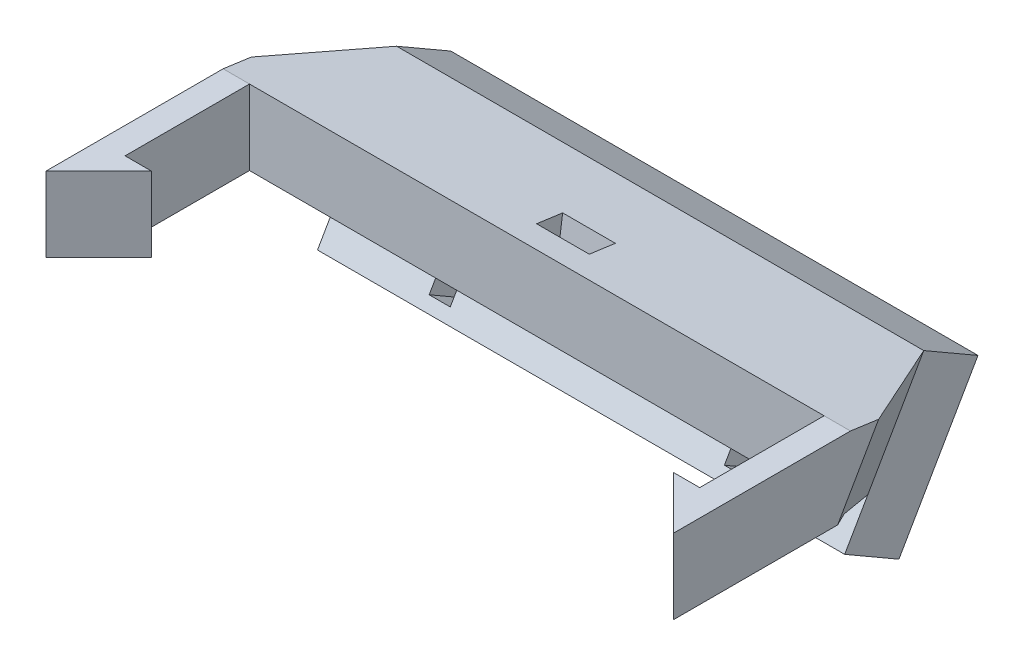
ISO-10303-21;
HEADER;
FILE_DESCRIPTION(('STEP AP214'),'2;1');
FILE_NAME('part.step','',(''),(''),'','','');
FILE_SCHEMA(('AUTOMOTIVE_DESIGN { 1 0 10303 214 1 1 1 1 }'));
ENDSEC;
DATA;
#1=APPLICATION_CONTEXT('core data for automotive mechanical design processes');
#2=APPLICATION_PROTOCOL_DEFINITION('international standard','automotive_design',2000,#1);
#3=PRODUCT_CONTEXT('',#1,'mechanical');
#4=PRODUCT('Part','Part','',(#3));
#5=PRODUCT_RELATED_PRODUCT_CATEGORY('part','',(#4));
#6=PRODUCT_DEFINITION_FORMATION('','',#4);
#7=PRODUCT_DEFINITION_CONTEXT('part definition',#1,'design');
#8=PRODUCT_DEFINITION('design','',#6,#7);
#9=PRODUCT_DEFINITION_SHAPE('','',#8);
#10=(LENGTH_UNIT() NAMED_UNIT(*) SI_UNIT(.MILLI.,.METRE.));
#11=(NAMED_UNIT(*) PLANE_ANGLE_UNIT() SI_UNIT($,.RADIAN.));
#12=(NAMED_UNIT(*) SI_UNIT($,.STERADIAN.) SOLID_ANGLE_UNIT());
#13=UNCERTAINTY_MEASURE_WITH_UNIT(LENGTH_MEASURE(1.E-05),#10,'distance_accuracy_value','');
#14=(GEOMETRIC_REPRESENTATION_CONTEXT(3) GLOBAL_UNCERTAINTY_ASSIGNED_CONTEXT((#13)) GLOBAL_UNIT_ASSIGNED_CONTEXT((#10,
#11,#12)) REPRESENTATION_CONTEXT('',''));
#15=CARTESIAN_POINT('',(0.,0.,0.));
#16=DIRECTION('',(0.,0.,1.));
#17=DIRECTION('',(1.,0.,0.));
#18=AXIS2_PLACEMENT_3D('',#15,#16,#17);
#19=CARTESIAN_POINT('',(37.7825,2.45728163563474,-14.859));
#20=DIRECTION('',(0.,-0.990554370221696,0.137120529588754));
#21=DIRECTION('',(0.,-0.137120529588754,-0.990554370221695));
#22=AXIS2_PLACEMENT_3D('',#19,#20,#21);
#23=PLANE('',#22);
#24=DIRECTION('',(0.,0.137120529588754,0.990554370221695));
#25=VECTOR('',#24,1.);
#26=CARTESIAN_POINT('',(37.7825,2.45728163563474,-14.859));
#27=LINE('',#26,#25);
#28=CARTESIAN_POINT('',(37.7825,4.04424143907504,-3.39485255702757));
#29=VERTEX_POINT('',#28);
#30=CARTESIAN_POINT('',(37.7825,4.51418432609816,0.));
#31=VERTEX_POINT('',#30);
#32=EDGE_CURVE('E332',#29,#31,#27,.T.);
#33=ORIENTED_EDGE('',*,*,#32,.F.);
#34=DIRECTION('',(-0.46221484131382,-0.121594094275768,-0.878391892441236));
#35=VECTOR('',#34,1.);
#36=CARTESIAN_POINT('',(33.0387987403693,2.79632378991416,-12.4097701974454));
#37=LINE('',#36,#35);
#38=CARTESIAN_POINT('',(31.75,2.45728163563474,-14.859));
#39=VERTEX_POINT('',#38);
#40=EDGE_CURVE('E384',#29,#39,#37,.T.);
#41=ORIENTED_EDGE('',*,*,#40,.T.);
#42=DIRECTION('',(1.,0.,0.));
#43=VECTOR('',#42,1.);
#44=CARTESIAN_POINT('',(37.7825,2.45728163563474,-14.859));
#45=LINE('',#44,#43);
#46=CARTESIAN_POINT('',(-31.75,2.45728163563474,-14.859));
#47=VERTEX_POINT('',#46);
#48=EDGE_CURVE('E324',#47,#39,#45,.T.);
#49=ORIENTED_EDGE('',*,*,#48,.F.);
#50=DIRECTION('',(-0.46221484131382,0.121594094275768,0.878391892441236));
#51=VECTOR('',#50,1.);
#52=CARTESIAN_POINT('',(-16.8948987294274,-1.45062530053327,-43.0895961452353));
#53=LINE('',#52,#51);
#54=CARTESIAN_POINT('',(-37.7825,4.04424143907504,-3.39485255702757));
#55=VERTEX_POINT('',#54);
#56=EDGE_CURVE('E369',#47,#55,#53,.T.);
#57=ORIENTED_EDGE('',*,*,#56,.T.);
#58=DIRECTION('',(0.,0.137120529588754,0.990554370221695));
#59=VECTOR('',#58,1.);
#60=CARTESIAN_POINT('',(-37.7825,2.45728163563474,-14.859));
#61=LINE('',#60,#59);
#62=CARTESIAN_POINT('',(-37.7825,4.51418432609816,0.));
#63=VERTEX_POINT('',#62);
#64=EDGE_CURVE('E333',#55,#63,#61,.T.);
#65=ORIENTED_EDGE('',*,*,#64,.T.);
#66=DIRECTION('',(-1.,0.,0.));
#67=VECTOR('',#66,1.);
#68=CARTESIAN_POINT('',(-37.7825,4.51418432609816,0.));
#69=LINE('',#68,#67);
#70=CARTESIAN_POINT('',(-34.6075,4.51418432609816,0.));
#71=VERTEX_POINT('',#70);
#72=EDGE_CURVE('E257',#71,#63,#69,.T.);
#73=ORIENTED_EDGE('',*,*,#72,.F.);
#74=DIRECTION('',(-1.,0.,0.));
#75=VECTOR('',#74,1.);
#76=CARTESIAN_POINT('',(37.7825,4.51418432609816,0.));
#77=LINE('',#76,#75);
#78=CARTESIAN_POINT('',(34.6075,4.51418432609816,0.));
#79=VERTEX_POINT('',#78);
#80=EDGE_CURVE('E327',#79,#71,#77,.T.);
#81=ORIENTED_EDGE('',*,*,#80,.F.);
#82=DIRECTION('',(-1.,0.,0.));
#83=VECTOR('',#82,1.);
#84=CARTESIAN_POINT('',(37.7825,4.51418432609816,0.));
#85=LINE('',#84,#83);
#86=EDGE_CURVE('E286',#31,#79,#85,.T.);
#87=ORIENTED_EDGE('',*,*,#86,.F.);
#88=EDGE_LOOP('',(#33,#41,#49,#57,#65,#73,#81,#87));
#89=FACE_BOUND('',#88,.T.);
#90=DIRECTION('',(0.,0.137120529588754,0.990554370221695));
#91=VECTOR('',#90,1.);
#92=CARTESIAN_POINT('',(-3.175,2.45728163563474,-14.859));
#93=LINE('',#92,#91);
#94=CARTESIAN_POINT('',(-3.175,3.64346896320957,-6.29002025090777));
#95=VERTEX_POINT('',#94);
#96=CARTESIAN_POINT('',(-3.175,4.07882664465387,-3.14501012545389));
#97=VERTEX_POINT('',#96);
#98=EDGE_CURVE('E339',#95,#97,#93,.T.);
#99=ORIENTED_EDGE('',*,*,#98,.F.);
#100=DIRECTION('',(-1.,0.,0.));
#101=VECTOR('',#100,1.);
#102=CARTESIAN_POINT('',(37.7825,3.64346896320957,-6.29002025090777));
#103=LINE('',#102,#101);
#104=CARTESIAN_POINT('',(3.175,3.64346896320957,-6.29002025090777));
#105=VERTEX_POINT('',#104);
#106=EDGE_CURVE('E347',#105,#95,#103,.T.);
#107=ORIENTED_EDGE('',*,*,#106,.F.);
#108=DIRECTION('',(0.,-0.137120529588754,-0.990554370221695));
#109=VECTOR('',#108,1.);
#110=CARTESIAN_POINT('',(3.175,2.45728163563474,-14.859));
#111=LINE('',#110,#109);
#112=CARTESIAN_POINT('',(3.175,4.07882664465387,-3.14501012545389));
#113=VERTEX_POINT('',#112);
#114=EDGE_CURVE('E344',#113,#105,#111,.T.);
#115=ORIENTED_EDGE('',*,*,#114,.F.);
#116=DIRECTION('',(1.,0.,0.));
#117=VECTOR('',#116,1.);
#118=CARTESIAN_POINT('',(37.7825,4.07882664465387,-3.14501012545389));
#119=LINE('',#118,#117);
#120=EDGE_CURVE('E342',#97,#113,#119,.T.);
#121=ORIENTED_EDGE('',*,*,#120,.F.);
#122=EDGE_LOOP('',(#99,#107,#115,#121));
#123=FACE_BOUND('',#122,.T.);
#124=ADVANCED_FACE('F33',(#89,#123),#23,.F.);
#125=CARTESIAN_POINT('',(37.7825,-9.20545357308142,-8.12551668776039));
#126=DIRECTION('',(0.,0.866025403784439,-0.5));
#127=DIRECTION('',(0.,0.5,0.866025403784439));
#128=AXIS2_PLACEMENT_3D('',#125,#126,#127);
#129=PLANE('',#128);
#130=DIRECTION('',(-1.,0.,0.));
#131=VECTOR('',#130,1.);
#132=CARTESIAN_POINT('',(37.7825,-9.20545357308142,-8.12551668776039));
#133=LINE('',#132,#131);
#134=CARTESIAN_POINT('',(31.75,-9.20545357308142,-8.12551668776039));
#135=VERTEX_POINT('',#134);
#136=CARTESIAN_POINT('',(-31.75,-9.20545357308143,-8.12551668776041));
#137=VERTEX_POINT('',#136);
#138=EDGE_CURVE('E241',#135,#137,#133,.T.);
#139=ORIENTED_EDGE('',*,*,#138,.F.);
#140=DIRECTION('',(0.490355767854127,0.435761179125731,0.754760502211889));
#141=VECTOR('',#140,1.);
#142=CARTESIAN_POINT('',(33.2005072597266,-7.9164409922874,-5.89288140622967));
#143=LINE('',#142,#141);
#144=CARTESIAN_POINT('',(37.0290175995719,-4.51418432609816,0.));
#145=VERTEX_POINT('',#144);
#146=EDGE_CURVE('E387',#135,#145,#143,.T.);
#147=ORIENTED_EDGE('',*,*,#146,.T.);
#148=DIRECTION('',(1.,0.,0.));
#149=VECTOR('',#148,1.);
#150=CARTESIAN_POINT('',(37.7825,-4.51418432609816,0.));
#151=LINE('',#150,#149);
#152=CARTESIAN_POINT('',(34.6075,-4.51418432609816,0.));
#153=VERTEX_POINT('',#152);
#154=EDGE_CURVE('E280',#153,#145,#151,.T.);
#155=ORIENTED_EDGE('',*,*,#154,.F.);
#156=DIRECTION('',(-1.,0.,0.));
#157=VECTOR('',#156,1.);
#158=CARTESIAN_POINT('',(37.7825,-4.51418432609816,0.));
#159=LINE('',#158,#157);
#160=CARTESIAN_POINT('',(-34.6075,-4.51418432609816,0.));
#161=VERTEX_POINT('',#160);
#162=EDGE_CURVE('E336',#153,#161,#159,.T.);
#163=ORIENTED_EDGE('',*,*,#162,.T.);
#164=DIRECTION('',(1.,0.,0.));
#165=VECTOR('',#164,1.);
#166=CARTESIAN_POINT('',(-37.7825,-4.51418432609816,0.));
#167=LINE('',#166,#165);
#168=CARTESIAN_POINT('',(-37.0290175995719,-4.51418432609816,0.));
#169=VERTEX_POINT('',#168);
#170=EDGE_CURVE('E263',#169,#161,#167,.T.);
#171=ORIENTED_EDGE('',*,*,#170,.F.);
#172=DIRECTION('',(0.490355767854127,-0.435761179125731,-0.754760502211889));
#173=VECTOR('',#172,1.);
#174=CARTESIAN_POINT('',(-15.0309952694675,-24.0630196359178,-33.859575985404));
#175=LINE('',#174,#173);
#176=EDGE_CURVE('E372',#169,#137,#175,.T.);
#177=ORIENTED_EDGE('',*,*,#176,.T.);
#178=EDGE_LOOP('',(#139,#147,#155,#163,#171,#177));
#179=FACE_BOUND('',#178,.T.);
#180=DIRECTION('',(0.,-0.5,-0.866025403784439));
#181=VECTOR('',#180,1.);
#182=CARTESIAN_POINT('',(-3.175,-10.6104980717669,-10.5591251463789));
#183=LINE('',#182,#181);
#184=CARTESIAN_POINT('',(-3.175,-5.55963649656401,-1.81077627613001));
#185=VERTEX_POINT('',#184);
#186=CARTESIAN_POINT('',(-3.175,-7.27324892364753,-4.77884006432008));
#187=VERTEX_POINT('',#186);
#188=EDGE_CURVE('E361',#185,#187,#183,.T.);
#189=ORIENTED_EDGE('',*,*,#188,.F.);
#190=DIRECTION('',(-1.,0.,0.));
#191=VECTOR('',#190,1.);
#192=CARTESIAN_POINT('',(-3.175,-5.55963649656401,-1.81077627613001));
#193=LINE('',#192,#191);
#194=CARTESIAN_POINT('',(3.175,-5.55963649656401,-1.81077627613001));
#195=VERTEX_POINT('',#194);
#196=EDGE_CURVE('E358',#195,#185,#193,.T.);
#197=ORIENTED_EDGE('',*,*,#196,.F.);
#198=DIRECTION('',(0.,0.5,0.866025403784439));
#199=VECTOR('',#198,1.);
#200=CARTESIAN_POINT('',(3.175,-10.6104980717669,-10.5591251463789));
#201=LINE('',#200,#199);
#202=CARTESIAN_POINT('',(3.175,-7.27324892364753,-4.77884006432008));
#203=VERTEX_POINT('',#202);
#204=EDGE_CURVE('E366',#203,#195,#201,.T.);
#205=ORIENTED_EDGE('',*,*,#204,.F.);
#206=DIRECTION('',(1.,0.,0.));
#207=VECTOR('',#206,1.);
#208=CARTESIAN_POINT('',(-3.175,-7.27324892364753,-4.77884006432008));
#209=LINE('',#208,#207);
#210=EDGE_CURVE('E363',#187,#203,#209,.T.);
#211=ORIENTED_EDGE('',*,*,#210,.F.);
#212=EDGE_LOOP('',(#189,#197,#205,#211));
#213=FACE_BOUND('',#212,.T.);
#214=ADVANCED_FACE('F495',(#179,#213),#129,.F.);
#215=CARTESIAN_POINT('',(0.,0.,0.));
#216=DIRECTION('',(0.,0.,1.));
#217=DIRECTION('',(1.,0.,0.));
#218=AXIS2_PLACEMENT_3D('',#215,#216,#217);
#219=PLANE('',#218);
#220=ORIENTED_EDGE('',*,*,#162,.F.);
#221=DIRECTION('',(0.,-1.,0.));
#222=VECTOR('',#221,1.);
#223=CARTESIAN_POINT('',(34.6075,4.51418432609816,0.));
#224=LINE('',#223,#222);
#225=EDGE_CURVE('E283',#79,#153,#224,.T.);
#226=ORIENTED_EDGE('',*,*,#225,.F.);
#227=ORIENTED_EDGE('',*,*,#80,.T.);
#228=DIRECTION('',(0.,1.,0.));
#229=VECTOR('',#228,1.);
#230=CARTESIAN_POINT('',(-34.6075,4.51418432609816,0.));
#231=LINE('',#230,#229);
#232=EDGE_CURVE('E260',#161,#71,#231,.T.);
#233=ORIENTED_EDGE('',*,*,#232,.F.);
#234=EDGE_LOOP('',(#220,#226,#227,#233));
#235=FACE_BOUND('',#234,.T.);
#236=ADVANCED_FACE('F501',(#235),#219,.T.);
#237=CARTESIAN_POINT('',(-37.7825,17.78,-3.175));
#238=DIRECTION('',(-1.,0.,0.));
#239=DIRECTION('',(0.,0.,1.));
#240=AXIS2_PLACEMENT_3D('',#237,#238,#239);
#241=PLANE('',#240);
#242=DIRECTION('',(0.,0.866025403784438,-0.500000000000001));
#243=VECTOR('',#242,1.);
#244=CARTESIAN_POINT('',(-37.7825,-25.8621498261207,13.8716104904235));
#245=LINE('',#244,#243);
#246=CARTESIAN_POINT('',(-37.7825,-4.51418432609816,1.54635686233462));
#247=VERTEX_POINT('',#246);
#248=EDGE_CURVE('E377',#247,#55,#245,.T.);
#249=ORIENTED_EDGE('',*,*,#248,.F.);
#250=DIRECTION('',(0.,0.,-1.));
#251=VECTOR('',#250,1.);
#252=CARTESIAN_POINT('',(-37.7825,-4.51418432609816,14.986));
#253=LINE('',#252,#251);
#254=CARTESIAN_POINT('',(-37.7825,-4.51418432609816,21.336));
#255=VERTEX_POINT('',#254);
#256=EDGE_CURVE('E243',#255,#247,#253,.T.);
#257=ORIENTED_EDGE('',*,*,#256,.F.);
#258=DIRECTION('',(0.,-1.,0.));
#259=VECTOR('',#258,1.);
#260=CARTESIAN_POINT('',(-37.7825,13.4944404471673,21.336));
#261=LINE('',#260,#259);
#262=CARTESIAN_POINT('',(-37.7825,4.51418432609816,21.336));
#263=VERTEX_POINT('',#262);
#264=EDGE_CURVE('E298',#263,#255,#261,.T.);
#265=ORIENTED_EDGE('',*,*,#264,.F.);
#266=DIRECTION('',(0.,0.,-1.));
#267=VECTOR('',#266,1.);
#268=CARTESIAN_POINT('',(-37.7825,4.51418432609816,14.986));
#269=LINE('',#268,#267);
#270=EDGE_CURVE('E253',#263,#63,#269,.T.);
#271=ORIENTED_EDGE('',*,*,#270,.T.);
#272=ORIENTED_EDGE('',*,*,#64,.F.);
#273=EDGE_LOOP('',(#249,#257,#265,#271,#272));
#274=FACE_BOUND('',#273,.T.);
#275=ADVANCED_FACE('F35',(#274),#241,.T.);
#276=CARTESIAN_POINT('',(37.7825,17.78,-3.175));
#277=DIRECTION('',(1.,0.,0.));
#278=DIRECTION('',(0.,0.,-1.));
#279=AXIS2_PLACEMENT_3D('',#276,#277,#278);
#280=PLANE('',#279);
#281=DIRECTION('',(0.,0.866025403784438,-0.500000000000001));
#282=VECTOR('',#281,1.);
#283=CARTESIAN_POINT('',(37.7825,-25.8621498261207,13.8716104904235));
#284=LINE('',#283,#282);
#285=CARTESIAN_POINT('',(37.7825,-4.51418432609816,1.54635686233462));
#286=VERTEX_POINT('',#285);
#287=EDGE_CURVE('E394',#286,#29,#284,.T.);
#288=ORIENTED_EDGE('',*,*,#287,.T.);
#289=ORIENTED_EDGE('',*,*,#32,.T.);
#290=DIRECTION('',(0.,0.,-1.));
#291=VECTOR('',#290,1.);
#292=CARTESIAN_POINT('',(37.7825,4.51418432609816,14.986));
#293=LINE('',#292,#291);
#294=CARTESIAN_POINT('',(37.7825,4.51418432609816,21.336));
#295=VERTEX_POINT('',#294);
#296=EDGE_CURVE('E265',#295,#31,#293,.T.);
#297=ORIENTED_EDGE('',*,*,#296,.F.);
#298=DIRECTION('',(0.,-1.,0.));
#299=VECTOR('',#298,1.);
#300=CARTESIAN_POINT('',(37.7825,13.4944404471673,21.336));
#301=LINE('',#300,#299);
#302=CARTESIAN_POINT('',(37.7825,-4.51418432609816,21.336));
#303=VERTEX_POINT('',#302);
#304=EDGE_CURVE('E311',#295,#303,#301,.T.);
#305=ORIENTED_EDGE('',*,*,#304,.T.);
#306=DIRECTION('',(0.,0.,-1.));
#307=VECTOR('',#306,1.);
#308=CARTESIAN_POINT('',(37.7825,-4.51418432609816,14.986));
#309=LINE('',#308,#307);
#310=EDGE_CURVE('E276',#303,#286,#309,.T.);
#311=ORIENTED_EDGE('',*,*,#310,.T.);
#312=EDGE_LOOP('',(#288,#289,#297,#305,#311));
#313=FACE_BOUND('',#312,.T.);
#314=ADVANCED_FACE('F553',(#313),#280,.T.);
#315=CARTESIAN_POINT('',(-37.7825,-4.51418432609816,14.986));
#316=DIRECTION('',(0.,1.,0.));
#317=DIRECTION('',(0.,0.,1.));
#318=AXIS2_PLACEMENT_3D('',#315,#316,#317);
#319=PLANE('',#318);
#320=ORIENTED_EDGE('',*,*,#256,.T.);
#321=DIRECTION('',(0.43803005719749,0.,-0.898960326706114));
#322=VECTOR('',#321,1.);
#323=CARTESIAN_POINT('',(-43.0746503640248,-4.51418432609816,12.4073312225409));
#324=LINE('',#323,#322);
#325=EDGE_CURVE('E374',#247,#169,#324,.T.);
#326=ORIENTED_EDGE('',*,*,#325,.T.);
#327=ORIENTED_EDGE('',*,*,#170,.T.);
#328=DIRECTION('',(0.,0.,-1.));
#329=VECTOR('',#328,1.);
#330=CARTESIAN_POINT('',(-34.6075,-4.51418432609816,14.986));
#331=LINE('',#330,#329);
#332=CARTESIAN_POINT('',(-34.6075,-4.51418432609816,14.986));
#333=VERTEX_POINT('',#332);
#334=EDGE_CURVE('E245',#333,#161,#331,.T.);
#335=ORIENTED_EDGE('',*,*,#334,.F.);
#336=DIRECTION('',(1.,0.,0.));
#337=VECTOR('',#336,1.);
#338=CARTESIAN_POINT('',(-37.7825,-4.51418432609816,14.986));
#339=LINE('',#338,#337);
#340=CARTESIAN_POINT('',(-31.4325,-4.51418432609816,14.986));
#341=VERTEX_POINT('',#340);
#342=EDGE_CURVE('E304',#333,#341,#339,.T.);
#343=ORIENTED_EDGE('',*,*,#342,.T.);
#344=DIRECTION('',(-0.707106781186547,0.,0.707106781186547));
#345=VECTOR('',#344,1.);
#346=CARTESIAN_POINT('',(-31.4325,-4.51418432609816,14.986));
#347=LINE('',#346,#345);
#348=EDGE_CURVE('E299',#341,#255,#347,.T.);
#349=ORIENTED_EDGE('',*,*,#348,.T.);
#350=EDGE_LOOP('',(#320,#326,#327,#335,#343,#349));
#351=FACE_BOUND('',#350,.T.);
#352=ADVANCED_FACE('F549',(#351),#319,.F.);
#353=CARTESIAN_POINT('',(-34.6075,4.51418432609816,14.986));
#354=DIRECTION('',(-1.,0.,0.));
#355=DIRECTION('',(0.,0.,1.));
#356=AXIS2_PLACEMENT_3D('',#353,#354,#355);
#357=PLANE('',#356);
#358=ORIENTED_EDGE('',*,*,#232,.T.);
#359=DIRECTION('',(0.,0.,-1.));
#360=VECTOR('',#359,1.);
#361=CARTESIAN_POINT('',(-34.6075,4.51418432609816,14.986));
#362=LINE('',#361,#360);
#363=CARTESIAN_POINT('',(-34.6075,4.51418432609816,14.986));
#364=VERTEX_POINT('',#363);
#365=EDGE_CURVE('E250',#364,#71,#362,.T.);
#366=ORIENTED_EDGE('',*,*,#365,.F.);
#367=DIRECTION('',(0.,1.,0.));
#368=VECTOR('',#367,1.);
#369=CARTESIAN_POINT('',(-34.6075,4.51418432609816,14.986));
#370=LINE('',#369,#368);
#371=EDGE_CURVE('E256',#333,#364,#370,.T.);
#372=ORIENTED_EDGE('',*,*,#371,.F.);
#373=ORIENTED_EDGE('',*,*,#334,.T.);
#374=EDGE_LOOP('',(#358,#366,#372,#373));
#375=FACE_BOUND('',#374,.T.);
#376=ADVANCED_FACE('F545',(#375),#357,.F.);
#377=CARTESIAN_POINT('',(-37.7825,4.51418432609816,14.986));
#378=DIRECTION('',(0.,-1.,0.));
#379=DIRECTION('',(0.,0.,-1.));
#380=AXIS2_PLACEMENT_3D('',#377,#378,#379);
#381=PLANE('',#380);
#382=ORIENTED_EDGE('',*,*,#72,.T.);
#383=ORIENTED_EDGE('',*,*,#270,.F.);
#384=DIRECTION('',(0.707106781186548,0.,-0.707106781186548));
#385=VECTOR('',#384,1.);
#386=CARTESIAN_POINT('',(-31.4325,4.51418432609816,14.986));
#387=LINE('',#386,#385);
#388=CARTESIAN_POINT('',(-31.4325,4.51418432609816,14.986));
#389=VERTEX_POINT('',#388);
#390=EDGE_CURVE('E294',#263,#389,#387,.T.);
#391=ORIENTED_EDGE('',*,*,#390,.T.);
#392=DIRECTION('',(-1.,0.,0.));
#393=VECTOR('',#392,1.);
#394=CARTESIAN_POINT('',(-37.7825,4.51418432609816,14.986));
#395=LINE('',#394,#393);
#396=EDGE_CURVE('E289',#389,#364,#395,.T.);
#397=ORIENTED_EDGE('',*,*,#396,.T.);
#398=ORIENTED_EDGE('',*,*,#365,.T.);
#399=EDGE_LOOP('',(#382,#383,#391,#397,#398));
#400=FACE_BOUND('',#399,.T.);
#401=ADVANCED_FACE('F541',(#400),#381,.F.);
#402=CARTESIAN_POINT('',(37.7825,4.51418432609816,14.986));
#403=DIRECTION('',(0.,-1.,0.));
#404=DIRECTION('',(1.,0.,0.));
#405=AXIS2_PLACEMENT_3D('',#402,#403,#404);
#406=PLANE('',#405);
#407=ORIENTED_EDGE('',*,*,#86,.T.);
#408=DIRECTION('',(0.,0.,-1.));
#409=VECTOR('',#408,1.);
#410=CARTESIAN_POINT('',(34.6075,4.51418432609816,14.986));
#411=LINE('',#410,#409);
#412=CARTESIAN_POINT('',(34.6075,4.51418432609816,14.986));
#413=VERTEX_POINT('',#412);
#414=EDGE_CURVE('E270',#413,#79,#411,.T.);
#415=ORIENTED_EDGE('',*,*,#414,.F.);
#416=DIRECTION('',(-1.,0.,0.));
#417=VECTOR('',#416,1.);
#418=CARTESIAN_POINT('',(37.7825,4.51418432609816,14.986));
#419=LINE('',#418,#417);
#420=CARTESIAN_POINT('',(31.4325,4.51418432609816,14.986));
#421=VERTEX_POINT('',#420);
#422=EDGE_CURVE('E310',#413,#421,#419,.T.);
#423=ORIENTED_EDGE('',*,*,#422,.T.);
#424=DIRECTION('',(0.707106781186548,0.,0.707106781186548));
#425=VECTOR('',#424,1.);
#426=CARTESIAN_POINT('',(31.4325,4.51418432609816,14.986));
#427=LINE('',#426,#425);
#428=EDGE_CURVE('E306',#421,#295,#427,.T.);
#429=ORIENTED_EDGE('',*,*,#428,.T.);
#430=ORIENTED_EDGE('',*,*,#296,.T.);
#431=EDGE_LOOP('',(#407,#415,#423,#429,#430));
#432=FACE_BOUND('',#431,.T.);
#433=ADVANCED_FACE('F537',(#432),#406,.F.);
#434=CARTESIAN_POINT('',(34.6075,4.51418432609816,14.986));
#435=DIRECTION('',(1.,0.,0.));
#436=DIRECTION('',(0.,0.,-1.));
#437=AXIS2_PLACEMENT_3D('',#434,#435,#436);
#438=PLANE('',#437);
#439=ORIENTED_EDGE('',*,*,#225,.T.);
#440=DIRECTION('',(0.,0.,-1.));
#441=VECTOR('',#440,1.);
#442=CARTESIAN_POINT('',(34.6075,-4.51418432609816,14.986));
#443=LINE('',#442,#441);
#444=CARTESIAN_POINT('',(34.6075,-4.51418432609816,14.986));
#445=VERTEX_POINT('',#444);
#446=EDGE_CURVE('E273',#445,#153,#443,.T.);
#447=ORIENTED_EDGE('',*,*,#446,.F.);
#448=DIRECTION('',(0.,-1.,0.));
#449=VECTOR('',#448,1.);
#450=CARTESIAN_POINT('',(34.6075,4.51418432609816,14.986));
#451=LINE('',#450,#449);
#452=EDGE_CURVE('E279',#413,#445,#451,.T.);
#453=ORIENTED_EDGE('',*,*,#452,.F.);
#454=ORIENTED_EDGE('',*,*,#414,.T.);
#455=EDGE_LOOP('',(#439,#447,#453,#454));
#456=FACE_BOUND('',#455,.T.);
#457=ADVANCED_FACE('F533',(#456),#438,.F.);
#458=CARTESIAN_POINT('',(37.7825,-4.51418432609816,14.986));
#459=DIRECTION('',(0.,1.,0.));
#460=DIRECTION('',(-1.,0.,0.));
#461=AXIS2_PLACEMENT_3D('',#458,#459,#460);
#462=PLANE('',#461);
#463=ORIENTED_EDGE('',*,*,#154,.T.);
#464=DIRECTION('',(0.43803005719749,0.,0.898960326706114));
#465=VECTOR('',#464,1.);
#466=CARTESIAN_POINT('',(43.0746503640248,-4.51418432609816,12.4073312225409));
#467=LINE('',#466,#465);
#468=EDGE_CURVE('E390',#145,#286,#467,.T.);
#469=ORIENTED_EDGE('',*,*,#468,.T.);
#470=ORIENTED_EDGE('',*,*,#310,.F.);
#471=DIRECTION('',(-0.707106781186547,0.,-0.707106781186548));
#472=VECTOR('',#471,1.);
#473=CARTESIAN_POINT('',(31.4325,-4.51418432609816,14.986));
#474=LINE('',#473,#472);
#475=CARTESIAN_POINT('',(31.4325,-4.51418432609816,14.986));
#476=VERTEX_POINT('',#475);
#477=EDGE_CURVE('E319',#303,#476,#474,.T.);
#478=ORIENTED_EDGE('',*,*,#477,.T.);
#479=DIRECTION('',(1.,0.,0.));
#480=VECTOR('',#479,1.);
#481=CARTESIAN_POINT('',(37.7825,-4.51418432609816,14.986));
#482=LINE('',#481,#480);
#483=EDGE_CURVE('E315',#476,#445,#482,.T.);
#484=ORIENTED_EDGE('',*,*,#483,.T.);
#485=ORIENTED_EDGE('',*,*,#446,.T.);
#486=EDGE_LOOP('',(#463,#469,#470,#478,#484,#485));
#487=FACE_BOUND('',#486,.T.);
#488=ADVANCED_FACE('F526',(#487),#462,.F.);
#489=CARTESIAN_POINT('',(-31.4325,13.4944404471673,14.986));
#490=DIRECTION('',(0.707106781186548,0.,0.707106781186548));
#491=DIRECTION('',(0.707106781186548,0.,-0.707106781186548));
#492=AXIS2_PLACEMENT_3D('',#489,#490,#491);
#493=PLANE('',#492);
#494=ORIENTED_EDGE('',*,*,#390,.F.);
#495=ORIENTED_EDGE('',*,*,#264,.T.);
#496=ORIENTED_EDGE('',*,*,#348,.F.);
#497=DIRECTION('',(0.,-1.,0.));
#498=VECTOR('',#497,1.);
#499=CARTESIAN_POINT('',(-31.4325,13.4944404471673,14.986));
#500=LINE('',#499,#498);
#501=EDGE_CURVE('E295',#389,#341,#500,.T.);
#502=ORIENTED_EDGE('',*,*,#501,.F.);
#503=EDGE_LOOP('',(#494,#495,#496,#502));
#504=FACE_BOUND('',#503,.T.);
#505=ADVANCED_FACE('F523',(#504),#493,.T.);
#506=CARTESIAN_POINT('',(-37.7825,13.4944404471673,14.986));
#507=DIRECTION('',(0.,0.,-1.));
#508=DIRECTION('',(-1.,0.,0.));
#509=AXIS2_PLACEMENT_3D('',#506,#507,#508);
#510=PLANE('',#509);
#511=ORIENTED_EDGE('',*,*,#342,.F.);
#512=ORIENTED_EDGE('',*,*,#371,.T.);
#513=ORIENTED_EDGE('',*,*,#396,.F.);
#514=ORIENTED_EDGE('',*,*,#501,.T.);
#515=EDGE_LOOP('',(#511,#512,#513,#514));
#516=FACE_BOUND('',#515,.T.);
#517=ADVANCED_FACE('F518',(#516),#510,.T.);
#518=CARTESIAN_POINT('',(37.7825,13.4944404471673,14.986));
#519=DIRECTION('',(0.,0.,-1.));
#520=DIRECTION('',(-1.,0.,0.));
#521=AXIS2_PLACEMENT_3D('',#518,#519,#520);
#522=PLANE('',#521);
#523=ORIENTED_EDGE('',*,*,#422,.F.);
#524=ORIENTED_EDGE('',*,*,#452,.T.);
#525=ORIENTED_EDGE('',*,*,#483,.F.);
#526=DIRECTION('',(0.,-1.,0.));
#527=VECTOR('',#526,1.);
#528=CARTESIAN_POINT('',(31.4325,13.4944404471673,14.986));
#529=LINE('',#528,#527);
#530=EDGE_CURVE('E314',#421,#476,#529,.T.);
#531=ORIENTED_EDGE('',*,*,#530,.F.);
#532=EDGE_LOOP('',(#523,#524,#525,#531));
#533=FACE_BOUND('',#532,.T.);
#534=ADVANCED_FACE('F515',(#533),#522,.T.);
#535=CARTESIAN_POINT('',(31.4325,13.4944404471673,14.986));
#536=DIRECTION('',(-0.707106781186547,0.,0.707106781186547));
#537=DIRECTION('',(0.707106781186548,0.,0.707106781186548));
#538=AXIS2_PLACEMENT_3D('',#535,#536,#537);
#539=PLANE('',#538);
#540=ORIENTED_EDGE('',*,*,#428,.F.);
#541=ORIENTED_EDGE('',*,*,#530,.T.);
#542=ORIENTED_EDGE('',*,*,#477,.F.);
#543=ORIENTED_EDGE('',*,*,#304,.F.);
#544=EDGE_LOOP('',(#540,#541,#542,#543));
#545=FACE_BOUND('',#544,.T.);
#546=ADVANCED_FACE('F513',(#545),#539,.T.);
#547=CARTESIAN_POINT('',(37.7825,-1.31530089779571,-21.3933046236485));
#548=DIRECTION('',(0.,-0.866025403784438,0.500000000000001));
#549=DIRECTION('',(0.,-0.500000000000001,-0.866025403784438));
#550=AXIS2_PLACEMENT_3D('',#547,#548,#549);
#551=PLANE('',#550);
#552=ORIENTED_EDGE('',*,*,#48,.T.);
#553=DIRECTION('',(0.,0.500000000000002,0.866025403784438));
#554=VECTOR('',#553,1.);
#555=CARTESIAN_POINT('',(31.75,-1.31530089779571,-21.3933046236485));
#556=LINE('',#555,#554);
#557=CARTESIAN_POINT('',(31.75,-1.31530089779571,-21.3933046236485));
#558=VERTEX_POINT('',#557);
#559=EDGE_CURVE('E398',#558,#39,#556,.T.);
#560=ORIENTED_EDGE('',*,*,#559,.F.);
#561=DIRECTION('',(1.,0.,0.));
#562=VECTOR('',#561,1.);
#563=CARTESIAN_POINT('',(37.7825,-1.31530089779571,-21.3933046236485));
#564=LINE('',#563,#562);
#565=CARTESIAN_POINT('',(-31.75,-1.31530089779571,-21.3933046236485));
#566=VERTEX_POINT('',#565);
#567=EDGE_CURVE('E322',#566,#558,#564,.T.);
#568=ORIENTED_EDGE('',*,*,#567,.F.);
#569=DIRECTION('',(0.,-0.500000000000001,-0.866025403784438));
#570=VECTOR('',#569,1.);
#571=CARTESIAN_POINT('',(-31.75,-1.31530089779571,-21.3933046236485));
#572=LINE('',#571,#570);
#573=EDGE_CURVE('E380',#47,#566,#572,.T.);
#574=ORIENTED_EDGE('',*,*,#573,.F.);
#575=EDGE_LOOP('',(#552,#560,#568,#574));
#576=FACE_BOUND('',#575,.T.);
#577=ADVANCED_FACE('F510',(#576),#551,.F.);
#578=CARTESIAN_POINT('',(0.,-9.59239786193828,-16.6145204632921));
#579=DIRECTION('',(0.,0.500000000000001,0.866025403784438));
#580=DIRECTION('',(0.,-0.866025403784438,0.500000000000001));
#581=AXIS2_PLACEMENT_3D('',#578,#579,#580);
#582=PLANE('',#581);
#583=DIRECTION('',(1.,0.,0.));
#584=VECTOR('',#583,1.);
#585=CARTESIAN_POINT('',(-19.05,-13.2105585641246,-14.5255744079135));
#586=LINE('',#585,#584);
#587=CARTESIAN_POINT('',(-19.05,-13.2105585641246,-14.5255744079135));
#588=VERTEX_POINT('',#587);
#589=CARTESIAN_POINT('',(-16.51,-13.2105585641246,-14.5255744079135));
#590=VERTEX_POINT('',#589);
#591=EDGE_CURVE('E451',#588,#590,#586,.T.);
#592=ORIENTED_EDGE('',*,*,#591,.F.);
#593=DIRECTION('',(0.,0.866025403784438,-0.500000000000001));
#594=VECTOR('',#593,1.);
#595=CARTESIAN_POINT('',(-19.05,-13.2105585641246,-14.5255744079135));
#596=LINE('',#595,#594);
#597=CARTESIAN_POINT('',(-19.05,-16.5101153525433,-12.6205744079135));
#598=VERTEX_POINT('',#597);
#599=EDGE_CURVE('E56',#598,#588,#596,.T.);
#600=ORIENTED_EDGE('',*,*,#599,.F.);
#601=DIRECTION('',(-1.,0.,0.));
#602=VECTOR('',#601,1.);
#603=CARTESIAN_POINT('',(-19.05,-16.5101153525433,-12.6205744079135));
#604=LINE('',#603,#602);
#605=CARTESIAN_POINT('',(-16.51,-16.5101153525433,-12.6205744079135));
#606=VERTEX_POINT('',#605);
#607=EDGE_CURVE('E441',#606,#598,#604,.T.);
#608=ORIENTED_EDGE('',*,*,#607,.F.);
#609=DIRECTION('',(0.,-0.866025403784438,0.500000000000001));
#610=VECTOR('',#609,1.);
#611=CARTESIAN_POINT('',(-16.51,-13.2105585641246,-14.5255744079135));
#612=LINE('',#611,#610);
#613=EDGE_CURVE('E448',#590,#606,#612,.T.);
#614=ORIENTED_EDGE('',*,*,#613,.F.);
#615=EDGE_LOOP('',(#592,#600,#608,#614));
#616=FACE_BOUND('',#615,.T.);
#617=DIRECTION('',(-1.,0.,0.));
#618=VECTOR('',#617,1.);
#619=CARTESIAN_POINT('',(19.05,-16.5101153525433,-12.6205744079135));
#620=LINE('',#619,#618);
#621=CARTESIAN_POINT('',(19.05,-16.5101153525433,-12.6205744079135));
#622=VERTEX_POINT('',#621);
#623=CARTESIAN_POINT('',(16.51,-16.5101153525433,-12.6205744079135));
#624=VERTEX_POINT('',#623);
#625=EDGE_CURVE('E421',#622,#624,#620,.T.);
#626=ORIENTED_EDGE('',*,*,#625,.F.);
#627=DIRECTION('',(0.,-0.866025403784438,0.500000000000001));
#628=VECTOR('',#627,1.);
#629=CARTESIAN_POINT('',(19.05,-13.2105585641246,-14.5255744079135));
#630=LINE('',#629,#628);
#631=CARTESIAN_POINT('',(19.05,-13.2105585641246,-14.5255744079135));
#632=VERTEX_POINT('',#631);
#633=EDGE_CURVE('E424',#632,#622,#630,.T.);
#634=ORIENTED_EDGE('',*,*,#633,.F.);
#635=DIRECTION('',(1.,0.,0.));
#636=VECTOR('',#635,1.);
#637=CARTESIAN_POINT('',(19.05,-13.2105585641246,-14.5255744079135));
#638=LINE('',#637,#636);
#639=CARTESIAN_POINT('',(16.51,-13.2105585641246,-14.5255744079135));
#640=VERTEX_POINT('',#639);
#641=EDGE_CURVE('E411',#640,#632,#638,.T.);
#642=ORIENTED_EDGE('',*,*,#641,.F.);
#643=DIRECTION('',(0.,0.866025403784438,-0.500000000000001));
#644=VECTOR('',#643,1.);
#645=CARTESIAN_POINT('',(16.51,-13.2105585641246,-14.5255744079135));
#646=LINE('',#645,#644);
#647=EDGE_CURVE('E418',#624,#640,#646,.T.);
#648=ORIENTED_EDGE('',*,*,#647,.F.);
#649=EDGE_LOOP('',(#626,#634,#642,#648));
#650=FACE_BOUND('',#649,.T.);
#651=DIRECTION('',(0.,0.866025403784438,-0.500000000000001));
#652=VECTOR('',#651,1.);
#653=CARTESIAN_POINT('',(31.75,-34.9955937695835,-1.94797846773629));
#654=LINE('',#653,#652);
#655=CARTESIAN_POINT('',(31.75,-17.8130848398892,-11.8683046236484));
#656=VERTEX_POINT('',#655);
#657=EDGE_CURVE('E397',#656,#558,#654,.T.);
#658=ORIENTED_EDGE('',*,*,#657,.F.);
#659=DIRECTION('',(1.,0.,0.));
#660=VECTOR('',#659,1.);
#661=CARTESIAN_POINT('',(65.0096747372082,-17.8130848398893,-11.8683046236485));
#662=LINE('',#661,#660);
#663=CARTESIAN_POINT('',(-31.75,-17.8130848398893,-11.8683046236485));
#664=VERTEX_POINT('',#663);
#665=EDGE_CURVE('E48',#664,#656,#662,.T.);
#666=ORIENTED_EDGE('',*,*,#665,.F.);
#667=DIRECTION('',(0.,0.866025403784438,-0.500000000000001));
#668=VECTOR('',#667,1.);
#669=CARTESIAN_POINT('',(-31.75,-34.9955937695835,-1.94797846773628));
#670=LINE('',#669,#668);
#671=EDGE_CURVE('E237',#664,#566,#670,.T.);
#672=ORIENTED_EDGE('',*,*,#671,.T.);
#673=ORIENTED_EDGE('',*,*,#567,.T.);
#674=EDGE_LOOP('',(#658,#666,#672,#673));
#675=FACE_BOUND('',#674,.T.);
#676=ADVANCED_FACE('F479',(#616,#650,#675),#582,.F.);
#677=CARTESIAN_POINT('',(37.7825,-17.78,-3.175));
#678=DIRECTION('',(0.,-0.5,-0.866025403784439));
#679=DIRECTION('',(0.,0.866025403784439,-0.5));
#680=AXIS2_PLACEMENT_3D('',#677,#678,#679);
#681=PLANE('',#680);
#682=DIRECTION('',(1.,0.,0.));
#683=VECTOR('',#682,1.);
#684=CARTESIAN_POINT('',(-19.05,-12.7375328191128,-6.08626978426508));
#685=LINE('',#684,#683);
#686=CARTESIAN_POINT('',(-19.05,-12.7375328191128,-6.08626978426509));
#687=VERTEX_POINT('',#686);
#688=CARTESIAN_POINT('',(-16.51,-12.7375328191128,-6.08626978426509));
#689=VERTEX_POINT('',#688);
#690=EDGE_CURVE('E458',#687,#689,#685,.T.);
#691=ORIENTED_EDGE('',*,*,#690,.F.);
#692=DIRECTION('',(0.,-0.866025403784439,0.5));
#693=VECTOR('',#692,1.);
#694=CARTESIAN_POINT('',(-19.05,-9.43797603069404,-7.99126978426511));
#695=LINE('',#694,#693);
#696=CARTESIAN_POINT('',(-19.05,-9.43797603069408,-7.99126978426509));
#697=VERTEX_POINT('',#696);
#698=EDGE_CURVE('E455',#697,#687,#695,.T.);
#699=ORIENTED_EDGE('',*,*,#698,.F.);
#700=DIRECTION('',(-1.,0.,0.));
#701=VECTOR('',#700,1.);
#702=CARTESIAN_POINT('',(-19.05,-9.43797603069408,-7.99126978426509));
#703=LINE('',#702,#701);
#704=CARTESIAN_POINT('',(-16.51,-9.43797603069408,-7.99126978426508));
#705=VERTEX_POINT('',#704);
#706=EDGE_CURVE('E434',#705,#697,#703,.T.);
#707=ORIENTED_EDGE('',*,*,#706,.F.);
#708=DIRECTION('',(0.,0.866025403784439,-0.5));
#709=VECTOR('',#708,1.);
#710=CARTESIAN_POINT('',(-16.51,-9.43797603069404,-7.99126978426511));
#711=LINE('',#710,#709);
#712=EDGE_CURVE('E461',#689,#705,#711,.T.);
#713=ORIENTED_EDGE('',*,*,#712,.F.);
#714=EDGE_LOOP('',(#691,#699,#707,#713));
#715=FACE_BOUND('',#714,.T.);
#716=DIRECTION('',(-1.,0.,0.));
#717=VECTOR('',#716,1.);
#718=CARTESIAN_POINT('',(19.05,-9.43797603069408,-7.99126978426508));
#719=LINE('',#718,#717);
#720=CARTESIAN_POINT('',(19.05,-9.43797603069409,-7.99126978426509));
#721=VERTEX_POINT('',#720);
#722=CARTESIAN_POINT('',(16.51,-9.43797603069409,-7.99126978426508));
#723=VERTEX_POINT('',#722);
#724=EDGE_CURVE('E429',#721,#723,#719,.T.);
#725=ORIENTED_EDGE('',*,*,#724,.F.);
#726=DIRECTION('',(0.,0.866025403784439,-0.5));
#727=VECTOR('',#726,1.);
#728=CARTESIAN_POINT('',(19.05,-9.43797603069405,-7.99126978426511));
#729=LINE('',#728,#727);
#730=CARTESIAN_POINT('',(19.05,-12.7375328191128,-6.08626978426508));
#731=VERTEX_POINT('',#730);
#732=EDGE_CURVE('E426',#731,#721,#729,.T.);
#733=ORIENTED_EDGE('',*,*,#732,.F.);
#734=DIRECTION('',(1.,0.,0.));
#735=VECTOR('',#734,1.);
#736=CARTESIAN_POINT('',(19.05,-12.7375328191128,-6.08626978426508));
#737=LINE('',#736,#735);
#738=CARTESIAN_POINT('',(16.51,-12.7375328191128,-6.08626978426508));
#739=VERTEX_POINT('',#738);
#740=EDGE_CURVE('E403',#739,#731,#737,.T.);
#741=ORIENTED_EDGE('',*,*,#740,.F.);
#742=DIRECTION('',(0.,-0.866025403784439,0.5));
#743=VECTOR('',#742,1.);
#744=CARTESIAN_POINT('',(16.51,-9.43797603069405,-7.99126978426511));
#745=LINE('',#744,#743);
#746=EDGE_CURVE('E432',#723,#739,#745,.T.);
#747=ORIENTED_EDGE('',*,*,#746,.F.);
#748=EDGE_LOOP('',(#725,#733,#741,#747));
#749=FACE_BOUND('',#748,.T.);
#750=DIRECTION('',(0.,-0.866025403784439,0.5));
#751=VECTOR('',#750,1.);
#752=CARTESIAN_POINT('',(-31.75,-17.7800000000001,-3.17499999999997));
#753=LINE('',#752,#751);
#754=CARTESIAN_POINT('',(-31.75,-14.0405023064588,-5.334));
#755=VERTEX_POINT('',#754);
#756=EDGE_CURVE('E41',#137,#755,#753,.T.);
#757=ORIENTED_EDGE('',*,*,#756,.T.);
#758=DIRECTION('',(-1.,0.,0.));
#759=VECTOR('',#758,1.);
#760=CARTESIAN_POINT('',(65.0096747372082,-14.0405023064588,-5.334));
#761=LINE('',#760,#759);
#762=CARTESIAN_POINT('',(31.75,-14.0405023064588,-5.334));
#763=VERTEX_POINT('',#762);
#764=EDGE_CURVE('E221',#763,#755,#761,.T.);
#765=ORIENTED_EDGE('',*,*,#764,.F.);
#766=DIRECTION('',(0.,0.866025403784439,-0.5));
#767=VECTOR('',#766,1.);
#768=CARTESIAN_POINT('',(31.75,-17.78,-3.175));
#769=LINE('',#768,#767);
#770=EDGE_CURVE('E11',#763,#135,#769,.T.);
#771=ORIENTED_EDGE('',*,*,#770,.T.);
#772=ORIENTED_EDGE('',*,*,#138,.T.);
#773=EDGE_LOOP('',(#757,#765,#771,#772));
#774=FACE_BOUND('',#773,.T.);
#775=ADVANCED_FACE('F239',(#715,#749,#774),#681,.F.);
#776=CARTESIAN_POINT('',(-3.175,6.54922183383016,-6.69225801235883));
#777=DIRECTION('',(1.,0.,0.));
#778=DIRECTION('',(0.,0.,-1.));
#779=AXIS2_PLACEMENT_3D('',#776,#777,#778);
#780=PLANE('',#779);
#781=ORIENTED_EDGE('',*,*,#98,.T.);
#782=DIRECTION('',(0.,-0.990554370221695,0.137120529588754));
#783=VECTOR('',#782,1.);
#784=CARTESIAN_POINT('',(-3.175,6.98457951527446,-3.54724788690495));
#785=LINE('',#784,#783);
#786=EDGE_CURVE('E349',#97,#185,#785,.T.);
#787=ORIENTED_EDGE('',*,*,#786,.T.);
#788=ORIENTED_EDGE('',*,*,#188,.T.);
#789=DIRECTION('',(0.,-0.990554370221695,0.137120529588754));
#790=VECTOR('',#789,1.);
#791=CARTESIAN_POINT('',(-3.175,6.54922183383016,-6.69225801235883));
#792=LINE('',#791,#790);
#793=EDGE_CURVE('E355',#95,#187,#792,.T.);
#794=ORIENTED_EDGE('',*,*,#793,.F.);
#795=EDGE_LOOP('',(#781,#787,#788,#794));
#796=FACE_BOUND('',#795,.T.);
#797=ADVANCED_FACE('F623',(#796),#780,.T.);
#798=CARTESIAN_POINT('',(-3.175,6.98457951527446,-3.54724788690495));
#799=DIRECTION('',(0.,-0.137120529588754,-0.990554370221695));
#800=DIRECTION('',(0.,0.990554370221695,-0.137120529588754));
#801=AXIS2_PLACEMENT_3D('',#798,#799,#800);
#802=PLANE('',#801);
#803=ORIENTED_EDGE('',*,*,#120,.T.);
#804=DIRECTION('',(0.,-0.990554370221695,0.137120529588754));
#805=VECTOR('',#804,1.);
#806=CARTESIAN_POINT('',(3.175,6.98457951527446,-3.54724788690495));
#807=LINE('',#806,#805);
#808=EDGE_CURVE('E351',#113,#195,#807,.T.);
#809=ORIENTED_EDGE('',*,*,#808,.T.);
#810=ORIENTED_EDGE('',*,*,#196,.T.);
#811=ORIENTED_EDGE('',*,*,#786,.F.);
#812=EDGE_LOOP('',(#803,#809,#810,#811));
#813=FACE_BOUND('',#812,.T.);
#814=ADVANCED_FACE('F619',(#813),#802,.T.);
#815=CARTESIAN_POINT('',(3.175,6.54922183383016,-6.69225801235883));
#816=DIRECTION('',(-1.,0.,0.));
#817=DIRECTION('',(0.,0.,1.));
#818=AXIS2_PLACEMENT_3D('',#815,#816,#817);
#819=PLANE('',#818);
#820=ORIENTED_EDGE('',*,*,#114,.T.);
#821=DIRECTION('',(0.,-0.990554370221695,0.137120529588754));
#822=VECTOR('',#821,1.);
#823=CARTESIAN_POINT('',(3.175,6.54922183383016,-6.69225801235883));
#824=LINE('',#823,#822);
#825=EDGE_CURVE('E353',#105,#203,#824,.T.);
#826=ORIENTED_EDGE('',*,*,#825,.T.);
#827=ORIENTED_EDGE('',*,*,#204,.T.);
#828=ORIENTED_EDGE('',*,*,#808,.F.);
#829=EDGE_LOOP('',(#820,#826,#827,#828));
#830=FACE_BOUND('',#829,.T.);
#831=ADVANCED_FACE('F615',(#830),#819,.T.);
#832=CARTESIAN_POINT('',(-3.175,6.54922183383016,-6.69225801235883));
#833=DIRECTION('',(0.,0.137120529588754,0.990554370221695));
#834=DIRECTION('',(0.,-0.990554370221695,0.137120529588754));
#835=AXIS2_PLACEMENT_3D('',#832,#833,#834);
#836=PLANE('',#835);
#837=ORIENTED_EDGE('',*,*,#106,.T.);
#838=ORIENTED_EDGE('',*,*,#793,.T.);
#839=ORIENTED_EDGE('',*,*,#210,.T.);
#840=ORIENTED_EDGE('',*,*,#825,.F.);
#841=EDGE_LOOP('',(#837,#838,#839,#840));
#842=FACE_BOUND('',#841,.T.);
#843=ADVANCED_FACE('F611',(#842),#836,.T.);
#844=CARTESIAN_POINT('',(-31.75,-34.9955937695835,-1.94797846773628));
#845=DIRECTION('',(1.,0.,0.));
#846=DIRECTION('',(0.,0.,-1.));
#847=AXIS2_PLACEMENT_3D('',#844,#845,#846);
#848=PLANE('',#847);
#849=ORIENTED_EDGE('',*,*,#671,.F.);
#850=DIRECTION('',(0.,-0.500000000000001,-0.866025403784438));
#851=VECTOR('',#850,1.);
#852=CARTESIAN_POINT('',(-31.75,2.14730112384786,22.7040980042288));
#853=LINE('',#852,#851);
#854=EDGE_CURVE('E224',#755,#664,#853,.T.);
#855=ORIENTED_EDGE('',*,*,#854,.F.);
#856=ORIENTED_EDGE('',*,*,#756,.F.);
#857=DIRECTION('',(0.,0.866025403784438,-0.500000000000001));
#858=VECTOR('',#857,1.);
#859=CARTESIAN_POINT('',(-31.75,-31.223011236153,4.58632615591214));
#860=LINE('',#859,#858);
#861=EDGE_CURVE('E379',#137,#47,#860,.T.);
#862=ORIENTED_EDGE('',*,*,#861,.T.);
#863=ORIENTED_EDGE('',*,*,#573,.T.);
#864=EDGE_LOOP('',(#849,#855,#856,#862,#863));
#865=FACE_BOUND('',#864,.T.);
#866=ADVANCED_FACE('F233',(#865),#848,.F.);
#867=CARTESIAN_POINT('',(-31.75,-31.223011236153,4.58632615591214));
#868=DIRECTION('',(0.871522358251462,0.245177883927064,0.424660551853898));
#869=DIRECTION('',(0.43803005719749,0.,-0.898960326706114));
#870=AXIS2_PLACEMENT_3D('',#867,#868,#869);
#871=PLANE('',#870);
#872=ORIENTED_EDGE('',*,*,#861,.F.);
#873=ORIENTED_EDGE('',*,*,#176,.F.);
#874=ORIENTED_EDGE('',*,*,#325,.F.);
#875=ORIENTED_EDGE('',*,*,#248,.T.);
#876=ORIENTED_EDGE('',*,*,#56,.F.);
#877=EDGE_LOOP('',(#872,#873,#874,#875,#876));
#878=FACE_BOUND('',#877,.T.);
#879=ADVANCED_FACE('F582',(#878),#871,.F.);
#880=CARTESIAN_POINT('',(31.75,-31.223011236153,4.58632615591214));
#881=DIRECTION('',(-0.871522358251462,0.245177883927064,0.424660551853898));
#882=DIRECTION('',(0.43803005719749,0.,0.898960326706114));
#883=AXIS2_PLACEMENT_3D('',#880,#881,#882);
#884=PLANE('',#883);
#885=ORIENTED_EDGE('',*,*,#287,.F.);
#886=ORIENTED_EDGE('',*,*,#468,.F.);
#887=ORIENTED_EDGE('',*,*,#146,.F.);
#888=DIRECTION('',(0.,0.866025403784438,-0.500000000000001));
#889=VECTOR('',#888,1.);
#890=CARTESIAN_POINT('',(31.75,-31.223011236153,4.58632615591214));
#891=LINE('',#890,#889);
#892=EDGE_CURVE('E393',#135,#39,#891,.T.);
#893=ORIENTED_EDGE('',*,*,#892,.T.);
#894=ORIENTED_EDGE('',*,*,#40,.F.);
#895=EDGE_LOOP('',(#885,#886,#887,#893,#894));
#896=FACE_BOUND('',#895,.T.);
#897=ADVANCED_FACE('F598',(#896),#884,.F.);
#898=CARTESIAN_POINT('',(31.75,-34.9955937695835,-1.94797846773629));
#899=DIRECTION('',(-1.,0.,0.));
#900=DIRECTION('',(0.,0.,1.));
#901=AXIS2_PLACEMENT_3D('',#898,#899,#900);
#902=PLANE('',#901);
#903=ORIENTED_EDGE('',*,*,#770,.F.);
#904=DIRECTION('',(0.,0.500000000000001,0.866025403784438));
#905=VECTOR('',#904,1.);
#906=CARTESIAN_POINT('',(31.75,2.14730112384786,22.7040980042288));
#907=LINE('',#906,#905);
#908=EDGE_CURVE('E225',#656,#763,#907,.T.);
#909=ORIENTED_EDGE('',*,*,#908,.F.);
#910=ORIENTED_EDGE('',*,*,#657,.T.);
#911=ORIENTED_EDGE('',*,*,#559,.T.);
#912=ORIENTED_EDGE('',*,*,#892,.F.);
#913=EDGE_LOOP('',(#903,#909,#910,#911,#912));
#914=FACE_BOUND('',#913,.T.);
#915=ADVANCED_FACE('F596',(#914),#902,.F.);
#916=CARTESIAN_POINT('',(19.05,6.74982739961258,20.0468282199637));
#917=DIRECTION('',(1.,0.,0.));
#918=DIRECTION('',(0.,0.,-1.));
#919=AXIS2_PLACEMENT_3D('',#916,#917,#918);
#920=PLANE('',#919);
#921=ORIENTED_EDGE('',*,*,#732,.T.);
#922=DIRECTION('',(0.,-0.500000000000001,-0.866025403784438));
#923=VECTOR('',#922,1.);
#924=CARTESIAN_POINT('',(19.05,6.74982739961258,20.0468282199637));
#925=LINE('',#924,#923);
#926=EDGE_CURVE('E406',#721,#632,#925,.T.);
#927=ORIENTED_EDGE('',*,*,#926,.T.);
#928=ORIENTED_EDGE('',*,*,#633,.T.);
#929=DIRECTION('',(0.,-0.500000000000001,-0.866025403784438));
#930=VECTOR('',#929,1.);
#931=CARTESIAN_POINT('',(19.05,3.45027061119387,21.9518282199637));
#932=LINE('',#931,#930);
#933=EDGE_CURVE('E407',#731,#622,#932,.T.);
#934=ORIENTED_EDGE('',*,*,#933,.F.);
#935=EDGE_LOOP('',(#921,#927,#928,#934));
#936=FACE_BOUND('',#935,.T.);
#937=ADVANCED_FACE('F605',(#936),#920,.F.);
#938=CARTESIAN_POINT('',(19.05,6.74982739961258,20.0468282199637));
#939=DIRECTION('',(0.,0.866025403784438,-0.500000000000001));
#940=DIRECTION('',(0.,0.500000000000001,0.866025403784438));
#941=AXIS2_PLACEMENT_3D('',#938,#939,#940);
#942=PLANE('',#941);
#943=ORIENTED_EDGE('',*,*,#724,.T.);
#944=DIRECTION('',(0.,-0.500000000000001,-0.866025403784438));
#945=VECTOR('',#944,1.);
#946=CARTESIAN_POINT('',(16.51,6.74982739961258,20.0468282199637));
#947=LINE('',#946,#945);
#948=EDGE_CURVE('E413',#723,#640,#947,.T.);
#949=ORIENTED_EDGE('',*,*,#948,.T.);
#950=ORIENTED_EDGE('',*,*,#641,.T.);
#951=ORIENTED_EDGE('',*,*,#926,.F.);
#952=EDGE_LOOP('',(#943,#949,#950,#951));
#953=FACE_BOUND('',#952,.T.);
#954=ADVANCED_FACE('F676',(#953),#942,.F.);
#955=CARTESIAN_POINT('',(16.51,6.74982739961258,20.0468282199637));
#956=DIRECTION('',(-1.,0.,0.));
#957=DIRECTION('',(0.,0.,1.));
#958=AXIS2_PLACEMENT_3D('',#955,#956,#957);
#959=PLANE('',#958);
#960=ORIENTED_EDGE('',*,*,#746,.T.);
#961=DIRECTION('',(0.,-0.500000000000001,-0.866025403784438));
#962=VECTOR('',#961,1.);
#963=CARTESIAN_POINT('',(16.51,3.45027061119387,21.9518282199637));
#964=LINE('',#963,#962);
#965=EDGE_CURVE('E410',#739,#624,#964,.T.);
#966=ORIENTED_EDGE('',*,*,#965,.T.);
#967=ORIENTED_EDGE('',*,*,#647,.T.);
#968=ORIENTED_EDGE('',*,*,#948,.F.);
#969=EDGE_LOOP('',(#960,#966,#967,#968));
#970=FACE_BOUND('',#969,.T.);
#971=ADVANCED_FACE('F685',(#970),#959,.F.);
#972=CARTESIAN_POINT('',(19.05,3.45027061119387,21.9518282199637));
#973=DIRECTION('',(0.,-0.866025403784438,0.500000000000001));
#974=DIRECTION('',(0.,-0.500000000000001,-0.866025403784438));
#975=AXIS2_PLACEMENT_3D('',#972,#973,#974);
#976=PLANE('',#975);
#977=ORIENTED_EDGE('',*,*,#740,.T.);
#978=ORIENTED_EDGE('',*,*,#933,.T.);
#979=ORIENTED_EDGE('',*,*,#625,.T.);
#980=ORIENTED_EDGE('',*,*,#965,.F.);
#981=EDGE_LOOP('',(#977,#978,#979,#980));
#982=FACE_BOUND('',#981,.T.);
#983=ADVANCED_FACE('F491',(#982),#976,.F.);
#984=CARTESIAN_POINT('',(-19.05,6.74982739961258,20.0468282199637));
#985=DIRECTION('',(-1.,0.,0.));
#986=DIRECTION('',(0.,0.,1.));
#987=AXIS2_PLACEMENT_3D('',#984,#985,#986);
#988=PLANE('',#987);
#989=ORIENTED_EDGE('',*,*,#698,.T.);
#990=DIRECTION('',(0.,-0.500000000000001,-0.866025403784438));
#991=VECTOR('',#990,1.);
#992=CARTESIAN_POINT('',(-19.05,3.45027061119388,21.9518282199637));
#993=LINE('',#992,#991);
#994=EDGE_CURVE('E437',#687,#598,#993,.T.);
#995=ORIENTED_EDGE('',*,*,#994,.T.);
#996=ORIENTED_EDGE('',*,*,#599,.T.);
#997=DIRECTION('',(0.,-0.500000000000001,-0.866025403784438));
#998=VECTOR('',#997,1.);
#999=CARTESIAN_POINT('',(-19.05,6.74982739961258,20.0468282199637));
#1000=LINE('',#999,#998);
#1001=EDGE_CURVE('E438',#697,#588,#1000,.T.);
#1002=ORIENTED_EDGE('',*,*,#1001,.F.);
#1003=EDGE_LOOP('',(#989,#995,#996,#1002));
#1004=FACE_BOUND('',#1003,.T.);
#1005=ADVANCED_FACE('F477',(#1004),#988,.F.);
#1006=CARTESIAN_POINT('',(-19.05,3.45027061119388,21.9518282199637));
#1007=DIRECTION('',(0.,-0.866025403784438,0.500000000000001));
#1008=DIRECTION('',(0.,-0.500000000000001,-0.866025403784438));
#1009=AXIS2_PLACEMENT_3D('',#1006,#1007,#1008);
#1010=PLANE('',#1009);
#1011=ORIENTED_EDGE('',*,*,#690,.T.);
#1012=DIRECTION('',(0.,-0.500000000000001,-0.866025403784438));
#1013=VECTOR('',#1012,1.);
#1014=CARTESIAN_POINT('',(-16.51,3.45027061119387,21.9518282199637));
#1015=LINE('',#1014,#1013);
#1016=EDGE_CURVE('E443',#689,#606,#1015,.T.);
#1017=ORIENTED_EDGE('',*,*,#1016,.T.);
#1018=ORIENTED_EDGE('',*,*,#607,.T.);
#1019=ORIENTED_EDGE('',*,*,#994,.F.);
#1020=EDGE_LOOP('',(#1011,#1017,#1018,#1019));
#1021=FACE_BOUND('',#1020,.T.);
#1022=ADVANCED_FACE('F483',(#1021),#1010,.F.);
#1023=CARTESIAN_POINT('',(-16.51,6.74982739961258,20.0468282199637));
#1024=DIRECTION('',(1.,0.,0.));
#1025=DIRECTION('',(0.,0.,-1.));
#1026=AXIS2_PLACEMENT_3D('',#1023,#1024,#1025);
#1027=PLANE('',#1026);
#1028=ORIENTED_EDGE('',*,*,#712,.T.);
#1029=DIRECTION('',(0.,-0.500000000000001,-0.866025403784438));
#1030=VECTOR('',#1029,1.);
#1031=CARTESIAN_POINT('',(-16.51,6.74982739961258,20.0468282199637));
#1032=LINE('',#1031,#1030);
#1033=EDGE_CURVE('E440',#705,#590,#1032,.T.);
#1034=ORIENTED_EDGE('',*,*,#1033,.T.);
#1035=ORIENTED_EDGE('',*,*,#613,.T.);
#1036=ORIENTED_EDGE('',*,*,#1016,.F.);
#1037=EDGE_LOOP('',(#1028,#1034,#1035,#1036));
#1038=FACE_BOUND('',#1037,.T.);
#1039=ADVANCED_FACE('F467',(#1038),#1027,.F.);
#1040=CARTESIAN_POINT('',(-19.05,6.74982739961258,20.0468282199637));
#1041=DIRECTION('',(0.,0.866025403784438,-0.500000000000001));
#1042=DIRECTION('',(0.,0.500000000000001,0.866025403784438));
#1043=AXIS2_PLACEMENT_3D('',#1040,#1041,#1042);
#1044=PLANE('',#1043);
#1045=ORIENTED_EDGE('',*,*,#706,.T.);
#1046=ORIENTED_EDGE('',*,*,#1001,.T.);
#1047=ORIENTED_EDGE('',*,*,#591,.T.);
#1048=ORIENTED_EDGE('',*,*,#1033,.F.);
#1049=EDGE_LOOP('',(#1045,#1046,#1047,#1048));
#1050=FACE_BOUND('',#1049,.T.);
#1051=ADVANCED_FACE('F472',(#1050),#1044,.F.);
#1052=CARTESIAN_POINT('',(65.0096747372082,2.14730112384786,22.7040980042288));
#1053=DIRECTION('',(0.,0.866025403784438,-0.500000000000001));
#1054=DIRECTION('',(0.,0.500000000000001,0.866025403784438));
#1055=AXIS2_PLACEMENT_3D('',#1052,#1053,#1054);
#1056=PLANE('',#1055);
#1057=ORIENTED_EDGE('',*,*,#854,.T.);
#1058=ORIENTED_EDGE('',*,*,#665,.T.);
#1059=ORIENTED_EDGE('',*,*,#908,.T.);
#1060=ORIENTED_EDGE('',*,*,#764,.T.);
#1061=EDGE_LOOP('',(#1057,#1058,#1059,#1060));
#1062=FACE_BOUND('',#1061,.T.);
#1063=ADVANCED_FACE('F223',(#1062),#1056,.F.);
#1064=CLOSED_SHELL('',(#124,#214,#236,#275,#314,#352,#376,#401,#433,#457,#488,#505,#517,#534,
#546,#577,#676,#775,#797,#814,#831,#843,#866,#879,#897,#915,#937,#954,#971,#983,#1005,#1022,
#1039,#1051,#1063));
#1065=MANIFOLD_SOLID_BREP('B2',#1064);
#1066=ADVANCED_BREP_SHAPE_REPRESENTATION('',(#18,#1065),#14);
#1067=SHAPE_DEFINITION_REPRESENTATION(#9,#1066);
ENDSEC;
END-ISO-10303-21;
